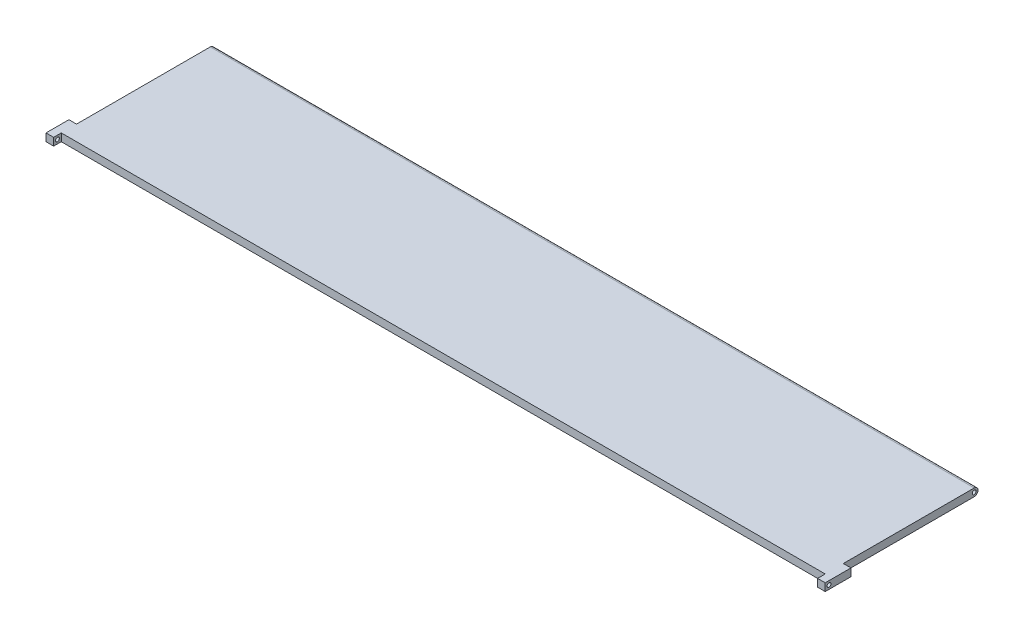
ISO-10303-21;
HEADER;
FILE_DESCRIPTION(('STEP AP214'),'2;1');
FILE_NAME('part.step','',(''),(''),'','','');
FILE_SCHEMA(('AUTOMOTIVE_DESIGN { 1 0 10303 214 1 1 1 1 }'));
ENDSEC;
DATA;
#1=APPLICATION_CONTEXT('core data for automotive mechanical design processes');
#2=APPLICATION_PROTOCOL_DEFINITION('international standard','automotive_design',2000,#1);
#3=PRODUCT_CONTEXT('',#1,'mechanical');
#4=PRODUCT('Part','Part','',(#3));
#5=PRODUCT_RELATED_PRODUCT_CATEGORY('part','',(#4));
#6=PRODUCT_DEFINITION_FORMATION('','',#4);
#7=PRODUCT_DEFINITION_CONTEXT('part definition',#1,'design');
#8=PRODUCT_DEFINITION('design','',#6,#7);
#9=PRODUCT_DEFINITION_SHAPE('','',#8);
#10=(LENGTH_UNIT() NAMED_UNIT(*) SI_UNIT(.MILLI.,.METRE.));
#11=(NAMED_UNIT(*) PLANE_ANGLE_UNIT() SI_UNIT($,.RADIAN.));
#12=(NAMED_UNIT(*) SI_UNIT($,.STERADIAN.) SOLID_ANGLE_UNIT());
#13=UNCERTAINTY_MEASURE_WITH_UNIT(LENGTH_MEASURE(1.E-05),#10,'distance_accuracy_value','');
#14=(GEOMETRIC_REPRESENTATION_CONTEXT(3) GLOBAL_UNCERTAINTY_ASSIGNED_CONTEXT((#13)) GLOBAL_UNIT_ASSIGNED_CONTEXT((#10,
#11,#12)) REPRESENTATION_CONTEXT('',''));
#15=CARTESIAN_POINT('',(0.,0.,0.));
#16=DIRECTION('',(0.,0.,1.));
#17=DIRECTION('',(1.,0.,0.));
#18=AXIS2_PLACEMENT_3D('',#15,#16,#17);
#19=CARTESIAN_POINT('',(-100.,2.,20.));
#20=DIRECTION('',(1.,0.,0.));
#21=DIRECTION('',(0.,0.,-1.));
#22=AXIS2_PLACEMENT_3D('',#19,#20,#21);
#23=PLANE('',#22);
#24=CARTESIAN_POINT('',(-100.,1.,-19.));
#25=DIRECTION('',(-1.,0.,0.));
#26=DIRECTION('',(0.,0.,1.));
#27=AXIS2_PLACEMENT_3D('',#24,#25,#26);
#28=CIRCLE('',#27,0.499999999999999);
#29=CARTESIAN_POINT('',(-100.,1.,-18.5));
#30=VERTEX_POINT('',#29);
#31=EDGE_CURVE('E241',#30,#30,#28,.T.);
#32=ORIENTED_EDGE('',*,*,#31,.F.);
#33=EDGE_LOOP('',(#32));
#34=FACE_BOUND('',#33,.T.);
#35=CARTESIAN_POINT('',(-100.,1.,-19.));
#36=DIRECTION('',(1.,0.,0.));
#37=DIRECTION('',(0.,0.,-1.));
#38=AXIS2_PLACEMENT_3D('',#35,#36,#37);
#39=CIRCLE('',#38,1.);
#40=CARTESIAN_POINT('',(-100.,2.,-19.));
#41=VERTEX_POINT('',#40);
#42=CARTESIAN_POINT('',(-100.,1.,-20.));
#43=VERTEX_POINT('',#42);
#44=EDGE_CURVE('E235',#41,#43,#39,.F.);
#45=ORIENTED_EDGE('',*,*,#44,.T.);
#46=CARTESIAN_POINT('',(-100.,1.,-19.));
#47=DIRECTION('',(1.,0.,0.));
#48=DIRECTION('',(0.,0.,-1.));
#49=AXIS2_PLACEMENT_3D('',#46,#47,#48);
#50=CIRCLE('',#49,1.);
#51=CARTESIAN_POINT('',(-100.,0.,-19.));
#52=VERTEX_POINT('',#51);
#53=EDGE_CURVE('E294',#43,#52,#50,.F.);
#54=ORIENTED_EDGE('',*,*,#53,.T.);
#55=DIRECTION('',(0.,0.,1.));
#56=VECTOR('',#55,1.);
#57=CARTESIAN_POINT('',(-100.,0.,20.));
#58=LINE('',#57,#56);
#59=CARTESIAN_POINT('',(-100.,0.,16.));
#60=VERTEX_POINT('',#59);
#61=EDGE_CURVE('E215',#52,#60,#58,.T.);
#62=ORIENTED_EDGE('',*,*,#61,.T.);
#63=DIRECTION('',(0.,-1.,0.));
#64=VECTOR('',#63,1.);
#65=CARTESIAN_POINT('',(-100.,0.,16.));
#66=LINE('',#65,#64);
#67=CARTESIAN_POINT('',(-100.,2.,16.));
#68=VERTEX_POINT('',#67);
#69=EDGE_CURVE('E151',#68,#60,#66,.T.);
#70=ORIENTED_EDGE('',*,*,#69,.F.);
#71=DIRECTION('',(0.,0.,1.));
#72=VECTOR('',#71,1.);
#73=CARTESIAN_POINT('',(-100.,2.,20.));
#74=LINE('',#73,#72);
#75=EDGE_CURVE('E242',#41,#68,#74,.T.);
#76=ORIENTED_EDGE('',*,*,#75,.F.);
#77=EDGE_LOOP('',(#45,#54,#62,#70,#76));
#78=FACE_BOUND('',#77,.T.);
#79=ADVANCED_FACE('F33',(#34,#78),#23,.F.);
#80=CARTESIAN_POINT('',(100.,2.,20.));
#81=DIRECTION('',(-1.,0.,0.));
#82=DIRECTION('',(0.,0.,1.));
#83=AXIS2_PLACEMENT_3D('',#80,#81,#82);
#84=PLANE('',#83);
#85=CARTESIAN_POINT('',(100.,1.,-19.));
#86=DIRECTION('',(-1.,0.,0.));
#87=DIRECTION('',(0.,0.,1.));
#88=AXIS2_PLACEMENT_3D('',#85,#86,#87);
#89=CIRCLE('',#88,0.499999999999999);
#90=CARTESIAN_POINT('',(100.,1.,-18.5));
#91=VERTEX_POINT('',#90);
#92=EDGE_CURVE('E237',#91,#91,#89,.T.);
#93=ORIENTED_EDGE('',*,*,#92,.T.);
#94=EDGE_LOOP('',(#93));
#95=FACE_BOUND('',#94,.T.);
#96=DIRECTION('',(0.,0.,-1.));
#97=VECTOR('',#96,1.);
#98=CARTESIAN_POINT('',(100.,0.,20.));
#99=LINE('',#98,#97);
#100=CARTESIAN_POINT('',(100.,0.,15.2591958413809));
#101=VERTEX_POINT('',#100);
#102=CARTESIAN_POINT('',(100.,0.,-19.));
#103=VERTEX_POINT('',#102);
#104=EDGE_CURVE('E214',#101,#103,#99,.T.);
#105=ORIENTED_EDGE('',*,*,#104,.T.);
#106=CARTESIAN_POINT('',(100.,1.,-19.));
#107=DIRECTION('',(-1.,0.,0.));
#108=DIRECTION('',(0.,0.,1.));
#109=AXIS2_PLACEMENT_3D('',#106,#107,#108);
#110=CIRCLE('',#109,1.);
#111=CARTESIAN_POINT('',(100.,1.,-20.));
#112=VERTEX_POINT('',#111);
#113=EDGE_CURVE('E42',#103,#112,#110,.F.);
#114=ORIENTED_EDGE('',*,*,#113,.T.);
#115=CARTESIAN_POINT('',(100.,1.,-19.));
#116=DIRECTION('',(-1.,0.,0.));
#117=DIRECTION('',(0.,0.,1.));
#118=AXIS2_PLACEMENT_3D('',#115,#116,#117);
#119=CIRCLE('',#118,1.);
#120=CARTESIAN_POINT('',(100.,2.,-19.));
#121=VERTEX_POINT('',#120);
#122=EDGE_CURVE('E49',#112,#121,#119,.F.);
#123=ORIENTED_EDGE('',*,*,#122,.T.);
#124=DIRECTION('',(0.,0.,-1.));
#125=VECTOR('',#124,1.);
#126=CARTESIAN_POINT('',(100.,2.,20.));
#127=LINE('',#126,#125);
#128=CARTESIAN_POINT('',(100.,2.,15.2591958413809));
#129=VERTEX_POINT('',#128);
#130=EDGE_CURVE('E222',#129,#121,#127,.T.);
#131=ORIENTED_EDGE('',*,*,#130,.F.);
#132=DIRECTION('',(0.,1.,0.));
#133=VECTOR('',#132,1.);
#134=CARTESIAN_POINT('',(100.,2.,15.2591958413809));
#135=LINE('',#134,#133);
#136=EDGE_CURVE('E183',#101,#129,#135,.T.);
#137=ORIENTED_EDGE('',*,*,#136,.F.);
#138=EDGE_LOOP('',(#105,#114,#123,#131,#137));
#139=FACE_BOUND('',#138,.T.);
#140=ADVANCED_FACE('F288',(#95,#139),#84,.F.);
#141=CARTESIAN_POINT('',(100.,2.,20.));
#142=DIRECTION('',(0.,0.,-1.));
#143=DIRECTION('',(-1.,0.,0.));
#144=AXIS2_PLACEMENT_3D('',#141,#142,#143);
#145=PLANE('',#144);
#146=DIRECTION('',(1.,0.,0.));
#147=VECTOR('',#146,1.);
#148=CARTESIAN_POINT('',(100.,0.,20.));
#149=LINE('',#148,#147);
#150=CARTESIAN_POINT('',(-100.,0.,20.));
#151=VERTEX_POINT('',#150);
#152=CARTESIAN_POINT('',(100.,0.,20.));
#153=VERTEX_POINT('',#152);
#154=EDGE_CURVE('E212',#151,#153,#149,.T.);
#155=ORIENTED_EDGE('',*,*,#154,.T.);
#156=DIRECTION('',(0.,-1.,0.));
#157=VECTOR('',#156,1.);
#158=CARTESIAN_POINT('',(100.,2.,20.));
#159=LINE('',#158,#157);
#160=CARTESIAN_POINT('',(100.,2.,20.));
#161=VERTEX_POINT('',#160);
#162=EDGE_CURVE('E218',#161,#153,#159,.T.);
#163=ORIENTED_EDGE('',*,*,#162,.F.);
#164=DIRECTION('',(1.,0.,0.));
#165=VECTOR('',#164,1.);
#166=CARTESIAN_POINT('',(100.,2.,20.));
#167=LINE('',#166,#165);
#168=CARTESIAN_POINT('',(-100.,2.,20.));
#169=VERTEX_POINT('',#168);
#170=EDGE_CURVE('E223',#169,#161,#167,.T.);
#171=ORIENTED_EDGE('',*,*,#170,.F.);
#172=DIRECTION('',(0.,-1.,0.));
#173=VECTOR('',#172,1.);
#174=CARTESIAN_POINT('',(-100.,2.,20.));
#175=LINE('',#174,#173);
#176=EDGE_CURVE('E221',#169,#151,#175,.T.);
#177=ORIENTED_EDGE('',*,*,#176,.T.);
#178=EDGE_LOOP('',(#155,#163,#171,#177));
#179=FACE_BOUND('',#178,.T.);
#180=ADVANCED_FACE('F318',(#179),#145,.F.);
#181=CARTESIAN_POINT('',(0.,2.,0.));
#182=DIRECTION('',(0.,1.,0.));
#183=DIRECTION('',(0.,0.,1.));
#184=AXIS2_PLACEMENT_3D('',#181,#182,#183);
#185=PLANE('',#184);
#186=ORIENTED_EDGE('',*,*,#130,.T.);
#187=DIRECTION('',(-1.,0.,0.));
#188=VECTOR('',#187,1.);
#189=CARTESIAN_POINT('',(-100.,2.,-19.));
#190=LINE('',#189,#188);
#191=EDGE_CURVE('E11',#121,#41,#190,.T.);
#192=ORIENTED_EDGE('',*,*,#191,.T.);
#193=ORIENTED_EDGE('',*,*,#75,.T.);
#194=DIRECTION('',(1.,0.,0.));
#195=VECTOR('',#194,1.);
#196=CARTESIAN_POINT('',(-102.,2.,16.));
#197=LINE('',#196,#195);
#198=CARTESIAN_POINT('',(-102.,2.,16.));
#199=VERTEX_POINT('',#198);
#200=EDGE_CURVE('E169',#199,#68,#197,.T.);
#201=ORIENTED_EDGE('',*,*,#200,.F.);
#202=DIRECTION('',(0.,0.,-1.));
#203=VECTOR('',#202,1.);
#204=CARTESIAN_POINT('',(-102.,2.,16.));
#205=LINE('',#204,#203);
#206=CARTESIAN_POINT('',(-102.,2.,22.));
#207=VERTEX_POINT('',#206);
#208=EDGE_CURVE('E143',#207,#199,#205,.T.);
#209=ORIENTED_EDGE('',*,*,#208,.F.);
#210=DIRECTION('',(1.,0.,0.));
#211=VECTOR('',#210,1.);
#212=CARTESIAN_POINT('',(-102.,2.,22.));
#213=LINE('',#212,#211);
#214=CARTESIAN_POINT('',(-100.,2.,22.));
#215=VERTEX_POINT('',#214);
#216=EDGE_CURVE('E157',#207,#215,#213,.T.);
#217=ORIENTED_EDGE('',*,*,#216,.T.);
#218=DIRECTION('',(0.,0.,-1.));
#219=VECTOR('',#218,1.);
#220=CARTESIAN_POINT('',(-100.,2.,16.));
#221=LINE('',#220,#219);
#222=EDGE_CURVE('E147',#215,#169,#221,.T.);
#223=ORIENTED_EDGE('',*,*,#222,.T.);
#224=ORIENTED_EDGE('',*,*,#170,.T.);
#225=DIRECTION('',(0.,0.,1.));
#226=VECTOR('',#225,1.);
#227=CARTESIAN_POINT('',(100.,2.,15.2591958413809));
#228=LINE('',#227,#226);
#229=CARTESIAN_POINT('',(100.,2.,22.));
#230=VERTEX_POINT('',#229);
#231=EDGE_CURVE('E204',#161,#230,#228,.T.);
#232=ORIENTED_EDGE('',*,*,#231,.T.);
#233=DIRECTION('',(-1.,0.,0.));
#234=VECTOR('',#233,1.);
#235=CARTESIAN_POINT('',(102.,2.,22.));
#236=LINE('',#235,#234);
#237=CARTESIAN_POINT('',(102.,2.,22.));
#238=VERTEX_POINT('',#237);
#239=EDGE_CURVE('E254',#238,#230,#236,.T.);
#240=ORIENTED_EDGE('',*,*,#239,.F.);
#241=DIRECTION('',(0.,0.,1.));
#242=VECTOR('',#241,1.);
#243=CARTESIAN_POINT('',(102.,2.,15.2591958413809));
#244=LINE('',#243,#242);
#245=CARTESIAN_POINT('',(102.,2.,15.2591958413809));
#246=VERTEX_POINT('',#245);
#247=EDGE_CURVE('E188',#246,#238,#244,.T.);
#248=ORIENTED_EDGE('',*,*,#247,.F.);
#249=DIRECTION('',(-1.,0.,0.));
#250=VECTOR('',#249,1.);
#251=CARTESIAN_POINT('',(102.,2.,15.2591958413809));
#252=LINE('',#251,#250);
#253=EDGE_CURVE('E252',#246,#129,#252,.T.);
#254=ORIENTED_EDGE('',*,*,#253,.T.);
#255=EDGE_LOOP('',(#186,#192,#193,#201,#209,#217,#223,#224,#232,#240,#248,#254));
#256=FACE_BOUND('',#255,.T.);
#257=ADVANCED_FACE('F271',(#256),#185,.T.);
#258=CARTESIAN_POINT('',(0.,0.,0.));
#259=DIRECTION('',(0.,1.,0.));
#260=DIRECTION('',(0.,0.,1.));
#261=AXIS2_PLACEMENT_3D('',#258,#259,#260);
#262=PLANE('',#261);
#263=ORIENTED_EDGE('',*,*,#61,.F.);
#264=DIRECTION('',(-1.,0.,0.));
#265=VECTOR('',#264,1.);
#266=CARTESIAN_POINT('',(0.,0.,-19.));
#267=LINE('',#266,#265);
#268=EDGE_CURVE('E291',#52,#103,#267,.F.);
#269=ORIENTED_EDGE('',*,*,#268,.T.);
#270=ORIENTED_EDGE('',*,*,#104,.F.);
#271=DIRECTION('',(-1.,0.,0.));
#272=VECTOR('',#271,1.);
#273=CARTESIAN_POINT('',(102.,0.,15.2591958413809));
#274=LINE('',#273,#272);
#275=CARTESIAN_POINT('',(102.,0.,15.2591958413809));
#276=VERTEX_POINT('',#275);
#277=EDGE_CURVE('E195',#276,#101,#274,.T.);
#278=ORIENTED_EDGE('',*,*,#277,.F.);
#279=DIRECTION('',(0.,0.,-1.));
#280=VECTOR('',#279,1.);
#281=CARTESIAN_POINT('',(102.,0.,15.2591958413809));
#282=LINE('',#281,#280);
#283=CARTESIAN_POINT('',(102.,0.,22.));
#284=VERTEX_POINT('',#283);
#285=EDGE_CURVE('E193',#284,#276,#282,.T.);
#286=ORIENTED_EDGE('',*,*,#285,.F.);
#287=DIRECTION('',(-1.,0.,0.));
#288=VECTOR('',#287,1.);
#289=CARTESIAN_POINT('',(102.,0.,22.));
#290=LINE('',#289,#288);
#291=CARTESIAN_POINT('',(100.,0.,22.));
#292=VERTEX_POINT('',#291);
#293=EDGE_CURVE('E209',#284,#292,#290,.T.);
#294=ORIENTED_EDGE('',*,*,#293,.T.);
#295=DIRECTION('',(0.,0.,-1.));
#296=VECTOR('',#295,1.);
#297=CARTESIAN_POINT('',(100.,0.,15.2591958413809));
#298=LINE('',#297,#296);
#299=EDGE_CURVE('E189',#292,#153,#298,.T.);
#300=ORIENTED_EDGE('',*,*,#299,.T.);
#301=ORIENTED_EDGE('',*,*,#154,.F.);
#302=DIRECTION('',(0.,0.,1.));
#303=VECTOR('',#302,1.);
#304=CARTESIAN_POINT('',(-100.,0.,16.));
#305=LINE('',#304,#303);
#306=CARTESIAN_POINT('',(-100.,0.,22.));
#307=VERTEX_POINT('',#306);
#308=EDGE_CURVE('E167',#151,#307,#305,.T.);
#309=ORIENTED_EDGE('',*,*,#308,.T.);
#310=DIRECTION('',(1.,0.,0.));
#311=VECTOR('',#310,1.);
#312=CARTESIAN_POINT('',(-102.,0.,22.));
#313=LINE('',#312,#311);
#314=CARTESIAN_POINT('',(-102.,0.,22.));
#315=VERTEX_POINT('',#314);
#316=EDGE_CURVE('E133',#315,#307,#313,.T.);
#317=ORIENTED_EDGE('',*,*,#316,.F.);
#318=DIRECTION('',(0.,0.,1.));
#319=VECTOR('',#318,1.);
#320=CARTESIAN_POINT('',(-102.,0.,16.));
#321=LINE('',#320,#319);
#322=CARTESIAN_POINT('',(-102.,0.,16.));
#323=VERTEX_POINT('',#322);
#324=EDGE_CURVE('E125',#323,#315,#321,.T.);
#325=ORIENTED_EDGE('',*,*,#324,.F.);
#326=DIRECTION('',(1.,0.,0.));
#327=VECTOR('',#326,1.);
#328=CARTESIAN_POINT('',(-102.,0.,16.));
#329=LINE('',#328,#327);
#330=EDGE_CURVE('E130',#323,#60,#329,.T.);
#331=ORIENTED_EDGE('',*,*,#330,.T.);
#332=EDGE_LOOP('',(#263,#269,#270,#278,#286,#294,#300,#301,#309,#317,#325,#331));
#333=FACE_BOUND('',#332,.T.);
#334=ADVANCED_FACE('F128',(#333),#262,.F.);
#335=CARTESIAN_POINT('',(102.,0.,0.));
#336=DIRECTION('',(-1.,0.,0.));
#337=DIRECTION('',(0.,0.,1.));
#338=AXIS2_PLACEMENT_3D('',#335,#336,#337);
#339=PLANE('',#338);
#340=DIRECTION('',(0.,1.,0.));
#341=VECTOR('',#340,1.);
#342=CARTESIAN_POINT('',(102.,2.,15.2591958413809));
#343=LINE('',#342,#341);
#344=EDGE_CURVE('E185',#276,#246,#343,.T.);
#345=ORIENTED_EDGE('',*,*,#344,.T.);
#346=ORIENTED_EDGE('',*,*,#247,.T.);
#347=DIRECTION('',(0.,-1.,0.));
#348=VECTOR('',#347,1.);
#349=CARTESIAN_POINT('',(102.,2.,22.));
#350=LINE('',#349,#348);
#351=EDGE_CURVE('E191',#238,#284,#350,.T.);
#352=ORIENTED_EDGE('',*,*,#351,.T.);
#353=ORIENTED_EDGE('',*,*,#285,.T.);
#354=EDGE_LOOP('',(#345,#346,#352,#353));
#355=FACE_BOUND('',#354,.T.);
#356=CARTESIAN_POINT('',(102.,1.,21.));
#357=DIRECTION('',(1.,0.,0.));
#358=DIRECTION('',(0.,0.,-1.));
#359=AXIS2_PLACEMENT_3D('',#356,#357,#358);
#360=CIRCLE('',#359,0.499999999999999);
#361=CARTESIAN_POINT('',(102.,1.,20.5));
#362=VERTEX_POINT('',#361);
#363=EDGE_CURVE('E155',#362,#362,#360,.T.);
#364=ORIENTED_EDGE('',*,*,#363,.F.);
#365=EDGE_LOOP('',(#364));
#366=FACE_BOUND('',#365,.T.);
#367=ADVANCED_FACE('F282',(#355,#366),#339,.F.);
#368=CARTESIAN_POINT('',(100.,0.,0.));
#369=DIRECTION('',(-1.,0.,0.));
#370=DIRECTION('',(0.,0.,1.));
#371=AXIS2_PLACEMENT_3D('',#368,#369,#370);
#372=PLANE('',#371);
#373=ORIENTED_EDGE('',*,*,#231,.F.);
#374=ORIENTED_EDGE('',*,*,#162,.T.);
#375=ORIENTED_EDGE('',*,*,#299,.F.);
#376=DIRECTION('',(0.,-1.,0.));
#377=VECTOR('',#376,1.);
#378=CARTESIAN_POINT('',(100.,2.,22.));
#379=LINE('',#378,#377);
#380=EDGE_CURVE('E267',#230,#292,#379,.T.);
#381=ORIENTED_EDGE('',*,*,#380,.F.);
#382=EDGE_LOOP('',(#373,#374,#375,#381));
#383=FACE_BOUND('',#382,.T.);
#384=CARTESIAN_POINT('',(100.,1.,21.));
#385=DIRECTION('',(1.,0.,0.));
#386=DIRECTION('',(0.,0.,-1.));
#387=AXIS2_PLACEMENT_3D('',#384,#385,#386);
#388=CIRCLE('',#387,0.499999999999999);
#389=CARTESIAN_POINT('',(100.,1.,20.5));
#390=VERTEX_POINT('',#389);
#391=EDGE_CURVE('E152',#390,#390,#388,.T.);
#392=ORIENTED_EDGE('',*,*,#391,.T.);
#393=EDGE_LOOP('',(#392));
#394=FACE_BOUND('',#393,.T.);
#395=ADVANCED_FACE('F275',(#383,#394),#372,.T.);
#396=CARTESIAN_POINT('',(102.,2.,15.2591958413809));
#397=DIRECTION('',(0.,0.,1.));
#398=DIRECTION('',(1.,0.,0.));
#399=AXIS2_PLACEMENT_3D('',#396,#397,#398);
#400=PLANE('',#399);
#401=ORIENTED_EDGE('',*,*,#136,.T.);
#402=ORIENTED_EDGE('',*,*,#253,.F.);
#403=ORIENTED_EDGE('',*,*,#344,.F.);
#404=ORIENTED_EDGE('',*,*,#277,.T.);
#405=EDGE_LOOP('',(#401,#402,#403,#404));
#406=FACE_BOUND('',#405,.T.);
#407=ADVANCED_FACE('F286',(#406),#400,.F.);
#408=CARTESIAN_POINT('',(102.,2.,22.));
#409=DIRECTION('',(0.,0.,-1.));
#410=DIRECTION('',(-1.,0.,0.));
#411=AXIS2_PLACEMENT_3D('',#408,#409,#410);
#412=PLANE('',#411);
#413=ORIENTED_EDGE('',*,*,#380,.T.);
#414=ORIENTED_EDGE('',*,*,#293,.F.);
#415=ORIENTED_EDGE('',*,*,#351,.F.);
#416=ORIENTED_EDGE('',*,*,#239,.T.);
#417=EDGE_LOOP('',(#413,#414,#415,#416));
#418=FACE_BOUND('',#417,.T.);
#419=ADVANCED_FACE('F280',(#418),#412,.F.);
#420=CARTESIAN_POINT('',(102.,1.,21.));
#421=DIRECTION('',(-1.,0.,0.));
#422=DIRECTION('',(0.,0.,1.));
#423=AXIS2_PLACEMENT_3D('',#420,#421,#422);
#424=CYLINDRICAL_SURFACE('',#423,0.499999999999999);
#425=ORIENTED_EDGE('',*,*,#363,.T.);
#426=EDGE_LOOP('',(#425));
#427=FACE_BOUND('',#426,.T.);
#428=ORIENTED_EDGE('',*,*,#391,.F.);
#429=EDGE_LOOP('',(#428));
#430=FACE_BOUND('',#429,.T.);
#431=ADVANCED_FACE('F334',(#427,#430),#424,.F.);
#432=CARTESIAN_POINT('',(-100.,0.,0.));
#433=DIRECTION('',(1.,0.,0.));
#434=DIRECTION('',(0.,0.,-1.));
#435=AXIS2_PLACEMENT_3D('',#432,#433,#434);
#436=PLANE('',#435);
#437=CARTESIAN_POINT('',(-100.,1.,21.));
#438=DIRECTION('',(-1.,0.,0.));
#439=DIRECTION('',(0.,0.,1.));
#440=AXIS2_PLACEMENT_3D('',#437,#438,#439);
#441=CIRCLE('',#440,0.499999999999999);
#442=CARTESIAN_POINT('',(-100.,1.,21.5));
#443=VERTEX_POINT('',#442);
#444=EDGE_CURVE('E240',#443,#443,#441,.T.);
#445=ORIENTED_EDGE('',*,*,#444,.T.);
#446=EDGE_LOOP('',(#445));
#447=FACE_BOUND('',#446,.T.);
#448=ORIENTED_EDGE('',*,*,#176,.F.);
#449=ORIENTED_EDGE('',*,*,#222,.F.);
#450=DIRECTION('',(0.,1.,0.));
#451=VECTOR('',#450,1.);
#452=CARTESIAN_POINT('',(-100.,0.,22.));
#453=LINE('',#452,#451);
#454=EDGE_CURVE('E177',#307,#215,#453,.T.);
#455=ORIENTED_EDGE('',*,*,#454,.F.);
#456=ORIENTED_EDGE('',*,*,#308,.F.);
#457=EDGE_LOOP('',(#448,#449,#455,#456));
#458=FACE_BOUND('',#457,.T.);
#459=ADVANCED_FACE('F341',(#447,#458),#436,.T.);
#460=CARTESIAN_POINT('',(-102.,0.,0.));
#461=DIRECTION('',(1.,0.,0.));
#462=DIRECTION('',(0.,0.,-1.));
#463=AXIS2_PLACEMENT_3D('',#460,#461,#462);
#464=PLANE('',#463);
#465=DIRECTION('',(0.,-1.,0.));
#466=VECTOR('',#465,1.);
#467=CARTESIAN_POINT('',(-102.,0.,16.));
#468=LINE('',#467,#466);
#469=EDGE_CURVE('E137',#199,#323,#468,.T.);
#470=ORIENTED_EDGE('',*,*,#469,.T.);
#471=ORIENTED_EDGE('',*,*,#324,.T.);
#472=DIRECTION('',(0.,1.,0.));
#473=VECTOR('',#472,1.);
#474=CARTESIAN_POINT('',(-102.,0.,22.));
#475=LINE('',#474,#473);
#476=EDGE_CURVE('E136',#315,#207,#475,.T.);
#477=ORIENTED_EDGE('',*,*,#476,.T.);
#478=ORIENTED_EDGE('',*,*,#208,.T.);
#479=EDGE_LOOP('',(#470,#471,#477,#478));
#480=FACE_BOUND('',#479,.T.);
#481=CARTESIAN_POINT('',(-102.,1.,21.));
#482=DIRECTION('',(-1.,0.,0.));
#483=DIRECTION('',(0.,0.,1.));
#484=AXIS2_PLACEMENT_3D('',#481,#482,#483);
#485=CIRCLE('',#484,0.499999999999999);
#486=CARTESIAN_POINT('',(-102.,1.,21.5));
#487=VERTEX_POINT('',#486);
#488=EDGE_CURVE('E168',#487,#487,#485,.T.);
#489=ORIENTED_EDGE('',*,*,#488,.F.);
#490=EDGE_LOOP('',(#489));
#491=FACE_BOUND('',#490,.T.);
#492=ADVANCED_FACE('F140',(#480,#491),#464,.F.);
#493=CARTESIAN_POINT('',(-102.,0.,16.));
#494=DIRECTION('',(0.,0.,1.));
#495=DIRECTION('',(1.,0.,0.));
#496=AXIS2_PLACEMENT_3D('',#493,#494,#495);
#497=PLANE('',#496);
#498=ORIENTED_EDGE('',*,*,#69,.T.);
#499=ORIENTED_EDGE('',*,*,#330,.F.);
#500=ORIENTED_EDGE('',*,*,#469,.F.);
#501=ORIENTED_EDGE('',*,*,#200,.T.);
#502=EDGE_LOOP('',(#498,#499,#500,#501));
#503=FACE_BOUND('',#502,.T.);
#504=ADVANCED_FACE('F149',(#503),#497,.F.);
#505=CARTESIAN_POINT('',(-102.,0.,22.));
#506=DIRECTION('',(0.,0.,-1.));
#507=DIRECTION('',(-1.,0.,0.));
#508=AXIS2_PLACEMENT_3D('',#505,#506,#507);
#509=PLANE('',#508);
#510=ORIENTED_EDGE('',*,*,#454,.T.);
#511=ORIENTED_EDGE('',*,*,#216,.F.);
#512=ORIENTED_EDGE('',*,*,#476,.F.);
#513=ORIENTED_EDGE('',*,*,#316,.T.);
#514=EDGE_LOOP('',(#510,#511,#512,#513));
#515=FACE_BOUND('',#514,.T.);
#516=ADVANCED_FACE('F345',(#515),#509,.F.);
#517=CARTESIAN_POINT('',(-102.,1.,21.));
#518=DIRECTION('',(1.,0.,0.));
#519=DIRECTION('',(0.,0.,-1.));
#520=AXIS2_PLACEMENT_3D('',#517,#518,#519);
#521=CYLINDRICAL_SURFACE('',#520,0.499999999999999);
#522=ORIENTED_EDGE('',*,*,#488,.T.);
#523=EDGE_LOOP('',(#522));
#524=FACE_BOUND('',#523,.T.);
#525=ORIENTED_EDGE('',*,*,#444,.F.);
#526=EDGE_LOOP('',(#525));
#527=FACE_BOUND('',#526,.T.);
#528=ADVANCED_FACE('F348',(#524,#527),#521,.F.);
#529=CARTESIAN_POINT('',(102.000025,1.,-19.));
#530=DIRECTION('',(-1.,0.,0.));
#531=DIRECTION('',(0.,0.,1.));
#532=AXIS2_PLACEMENT_3D('',#529,#530,#531);
#533=CYLINDRICAL_SURFACE('',#532,0.499999999999999);
#534=ORIENTED_EDGE('',*,*,#31,.T.);
#535=EDGE_LOOP('',(#534));
#536=FACE_BOUND('',#535,.T.);
#537=ORIENTED_EDGE('',*,*,#92,.F.);
#538=EDGE_LOOP('',(#537));
#539=FACE_BOUND('',#538,.T.);
#540=ADVANCED_FACE('F311',(#536,#539),#533,.F.);
#541=CARTESIAN_POINT('',(0.,1.,-19.));
#542=DIRECTION('',(1.,0.,0.));
#543=DIRECTION('',(0.,0.,-1.));
#544=AXIS2_PLACEMENT_3D('',#541,#542,#543);
#545=CYLINDRICAL_SURFACE('',#544,1.);
#546=ORIENTED_EDGE('',*,*,#191,.F.);
#547=ORIENTED_EDGE('',*,*,#122,.F.);
#548=DIRECTION('',(-1.,0.,0.));
#549=VECTOR('',#548,1.);
#550=CARTESIAN_POINT('',(100.,1.,-20.));
#551=LINE('',#550,#549);
#552=EDGE_CURVE('E37',#43,#112,#551,.F.);
#553=ORIENTED_EDGE('',*,*,#552,.F.);
#554=ORIENTED_EDGE('',*,*,#44,.F.);
#555=EDGE_LOOP('',(#546,#547,#553,#554));
#556=FACE_BOUND('',#555,.T.);
#557=ADVANCED_FACE('F35',(#556),#545,.T.);
#558=CARTESIAN_POINT('',(100.,1.,-19.));
#559=DIRECTION('',(-1.,0.,0.));
#560=DIRECTION('',(0.,0.,1.));
#561=AXIS2_PLACEMENT_3D('',#558,#559,#560);
#562=CYLINDRICAL_SURFACE('',#561,1.);
#563=ORIENTED_EDGE('',*,*,#113,.F.);
#564=ORIENTED_EDGE('',*,*,#268,.F.);
#565=ORIENTED_EDGE('',*,*,#53,.F.);
#566=ORIENTED_EDGE('',*,*,#552,.T.);
#567=EDGE_LOOP('',(#563,#564,#565,#566));
#568=FACE_BOUND('',#567,.T.);
#569=ADVANCED_FACE('F306',(#568),#562,.T.);
#570=CLOSED_SHELL('',(#79,#140,#180,#257,#334,#367,#395,#407,#419,#431,#459,#492,#504,#516,#528,
#540,#557,#569));
#571=MANIFOLD_SOLID_BREP('B2',#570);
#572=ADVANCED_BREP_SHAPE_REPRESENTATION('',(#18,#571),#14);
#573=SHAPE_DEFINITION_REPRESENTATION(#9,#572);
ENDSEC;
END-ISO-10303-21;
